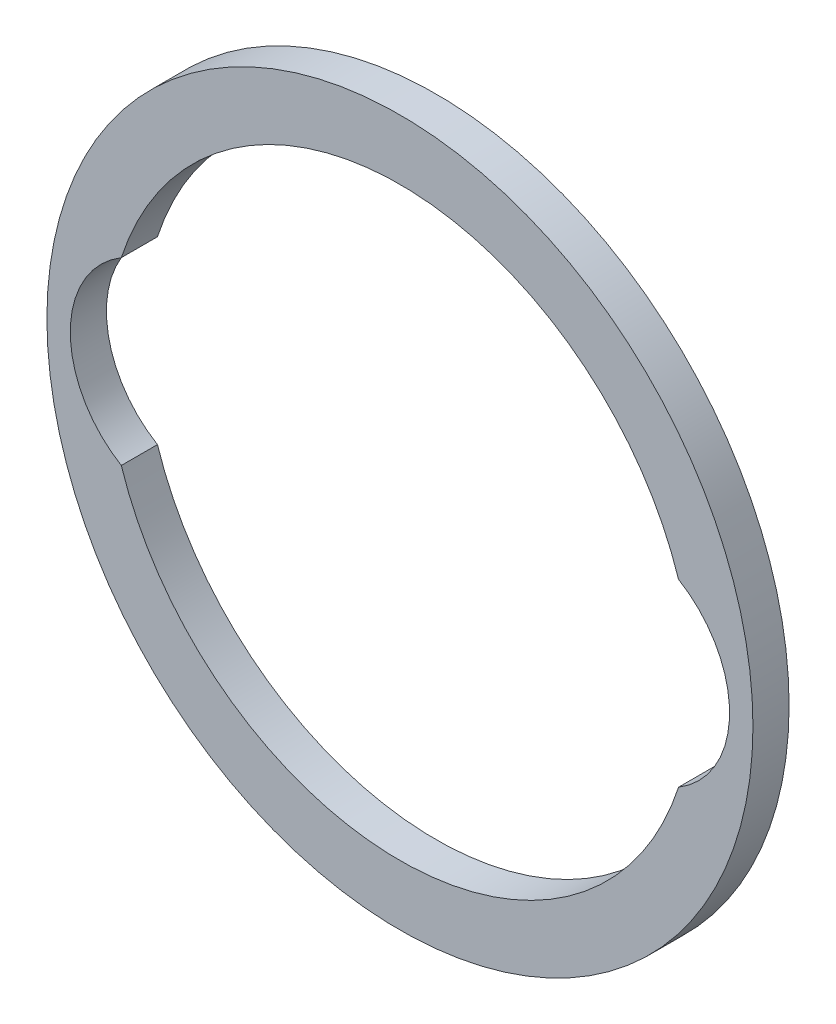
ISO-10303-21;
HEADER;
FILE_DESCRIPTION(('STEP AP214'),'2;1');
FILE_NAME('part.step','',(''),(''),'','','');
FILE_SCHEMA(('AUTOMOTIVE_DESIGN { 1 0 10303 214 1 1 1 1 }'));
ENDSEC;
DATA;
#1=APPLICATION_CONTEXT('core data for automotive mechanical design processes');
#2=APPLICATION_PROTOCOL_DEFINITION('international standard','automotive_design',2000,#1);
#3=PRODUCT_CONTEXT('',#1,'mechanical');
#4=PRODUCT('Part','Part','',(#3));
#5=PRODUCT_RELATED_PRODUCT_CATEGORY('part','',(#4));
#6=PRODUCT_DEFINITION_FORMATION('','',#4);
#7=PRODUCT_DEFINITION_CONTEXT('part definition',#1,'design');
#8=PRODUCT_DEFINITION('design','',#6,#7);
#9=PRODUCT_DEFINITION_SHAPE('','',#8);
#10=(LENGTH_UNIT() NAMED_UNIT(*) SI_UNIT(.MILLI.,.METRE.));
#11=(NAMED_UNIT(*) PLANE_ANGLE_UNIT() SI_UNIT($,.RADIAN.));
#12=(NAMED_UNIT(*) SI_UNIT($,.STERADIAN.) SOLID_ANGLE_UNIT());
#13=UNCERTAINTY_MEASURE_WITH_UNIT(LENGTH_MEASURE(1.E-05),#10,'distance_accuracy_value','');
#14=(GEOMETRIC_REPRESENTATION_CONTEXT(3) GLOBAL_UNCERTAINTY_ASSIGNED_CONTEXT((#13)) GLOBAL_UNIT_ASSIGNED_CONTEXT((#10,
#11,#12)) REPRESENTATION_CONTEXT('',''));
#15=CARTESIAN_POINT('',(0.,0.,0.));
#16=DIRECTION('',(0.,0.,1.));
#17=DIRECTION('',(1.,0.,0.));
#18=AXIS2_PLACEMENT_3D('',#15,#16,#17);
#19=CARTESIAN_POINT('',(-37.3215231594437,0.00123870368374164,6.));
#20=DIRECTION('',(0.,0.,-1.));
#21=DIRECTION('',(-1.,0.,0.));
#22=AXIS2_PLACEMENT_3D('',#19,#20,#21);
#23=CYLINDRICAL_SURFACE('',#22,17.4);
#24=CARTESIAN_POINT('',(-37.3215231594437,0.00123870368374164,0.));
#25=DIRECTION('',(0.,0.,1.));
#26=DIRECTION('',(1.,0.,0.));
#27=AXIS2_PLACEMENT_3D('',#24,#25,#26);
#28=CIRCLE('',#27,17.4);
#29=CARTESIAN_POINT('',(-46.2485557715222,-14.9342254251235,0.));
#30=VERTEX_POINT('',#29);
#31=CARTESIAN_POINT('',(-46.2475643338818,14.9372953771245,0.));
#32=VERTEX_POINT('',#31);
#33=EDGE_CURVE('E103',#30,#32,#28,.F.);
#34=ORIENTED_EDGE('',*,*,#33,.T.);
#35=DIRECTION('',(0.,0.,-1.));
#36=VECTOR('',#35,1.);
#37=CARTESIAN_POINT('',(-46.2475643338818,14.9372953771245,6.));
#38=LINE('',#37,#36);
#39=CARTESIAN_POINT('',(-46.2475643338818,14.9372953771245,6.));
#40=VERTEX_POINT('',#39);
#41=EDGE_CURVE('E11',#40,#32,#38,.T.);
#42=ORIENTED_EDGE('',*,*,#41,.F.);
#43=CARTESIAN_POINT('',(-37.3215231594437,0.00123870368374164,6.));
#44=DIRECTION('',(0.,0.,1.));
#45=DIRECTION('',(1.,0.,0.));
#46=AXIS2_PLACEMENT_3D('',#43,#44,#45);
#47=CIRCLE('',#46,17.4);
#48=CARTESIAN_POINT('',(-46.2485557715222,-14.9342254251235,6.));
#49=VERTEX_POINT('',#48);
#50=EDGE_CURVE('E76',#49,#40,#47,.F.);
#51=ORIENTED_EDGE('',*,*,#50,.F.);
#52=DIRECTION('',(0.,0.,-1.));
#53=VECTOR('',#52,1.);
#54=CARTESIAN_POINT('',(-46.2485557715222,-14.9342254251235,6.));
#55=LINE('',#54,#53);
#56=EDGE_CURVE('E52',#49,#30,#55,.T.);
#57=ORIENTED_EDGE('',*,*,#56,.T.);
#58=EDGE_LOOP('',(#34,#42,#51,#57));
#59=FACE_BOUND('',#58,.T.);
#60=ADVANCED_FACE('F36',(#59),#23,.F.);
#61=CARTESIAN_POINT('',(0.,0.,6.));
#62=DIRECTION('',(0.,0.,-1.));
#63=DIRECTION('',(-1.,0.,0.));
#64=AXIS2_PLACEMENT_3D('',#61,#62,#63);
#65=CYLINDRICAL_SURFACE('',#64,48.6);
#66=CARTESIAN_POINT('',(0.,0.,0.));
#67=DIRECTION('',(0.,0.,1.));
#68=DIRECTION('',(1.,0.,0.));
#69=AXIS2_PLACEMENT_3D('',#66,#67,#68);
#70=CIRCLE('',#69,48.6);
#71=CARTESIAN_POINT('',(46.2475643338818,14.9372953771245,0.));
#72=VERTEX_POINT('',#71);
#73=EDGE_CURVE('E85',#72,#32,#70,.T.);
#74=ORIENTED_EDGE('',*,*,#73,.F.);
#75=DIRECTION('',(0.,0.,-1.));
#76=VECTOR('',#75,1.);
#77=CARTESIAN_POINT('',(46.2475643338818,14.9372953771245,6.));
#78=LINE('',#77,#76);
#79=CARTESIAN_POINT('',(46.2475643338818,14.9372953771245,6.));
#80=VERTEX_POINT('',#79);
#81=EDGE_CURVE('E44',#80,#72,#78,.T.);
#82=ORIENTED_EDGE('',*,*,#81,.F.);
#83=CARTESIAN_POINT('',(0.,0.,6.));
#84=DIRECTION('',(0.,0.,1.));
#85=DIRECTION('',(1.,0.,0.));
#86=AXIS2_PLACEMENT_3D('',#83,#84,#85);
#87=CIRCLE('',#86,48.6);
#88=EDGE_CURVE('E83',#80,#40,#87,.T.);
#89=ORIENTED_EDGE('',*,*,#88,.T.);
#90=ORIENTED_EDGE('',*,*,#41,.T.);
#91=EDGE_LOOP('',(#74,#82,#89,#90));
#92=FACE_BOUND('',#91,.T.);
#93=ADVANCED_FACE('F82',(#92),#65,.F.);
#94=CARTESIAN_POINT('',(37.3215231594437,0.00123870368375079,6.));
#95=DIRECTION('',(0.,0.,-1.));
#96=DIRECTION('',(-1.,0.,0.));
#97=AXIS2_PLACEMENT_3D('',#94,#95,#96);
#98=CYLINDRICAL_SURFACE('',#97,17.4);
#99=CARTESIAN_POINT('',(37.3215231594437,0.00123870368375079,0.));
#100=DIRECTION('',(0.,0.,1.));
#101=DIRECTION('',(1.,0.,0.));
#102=AXIS2_PLACEMENT_3D('',#99,#100,#101);
#103=CIRCLE('',#102,17.4);
#104=CARTESIAN_POINT('',(46.2485557715222,-14.9342254251235,0.));
#105=VERTEX_POINT('',#104);
#106=EDGE_CURVE('E106',#105,#72,#103,.T.);
#107=ORIENTED_EDGE('',*,*,#106,.F.);
#108=DIRECTION('',(0.,0.,-1.));
#109=VECTOR('',#108,1.);
#110=CARTESIAN_POINT('',(46.2485557715222,-14.9342254251235,6.));
#111=LINE('',#110,#109);
#112=CARTESIAN_POINT('',(46.2485557715222,-14.9342254251235,6.));
#113=VERTEX_POINT('',#112);
#114=EDGE_CURVE('E65',#113,#105,#111,.T.);
#115=ORIENTED_EDGE('',*,*,#114,.F.);
#116=CARTESIAN_POINT('',(37.3215231594437,0.00123870368375079,6.));
#117=DIRECTION('',(0.,0.,1.));
#118=DIRECTION('',(1.,0.,0.));
#119=AXIS2_PLACEMENT_3D('',#116,#117,#118);
#120=CIRCLE('',#119,17.4);
#121=EDGE_CURVE('E92',#113,#80,#120,.T.);
#122=ORIENTED_EDGE('',*,*,#121,.T.);
#123=ORIENTED_EDGE('',*,*,#81,.T.);
#124=EDGE_LOOP('',(#107,#115,#122,#123));
#125=FACE_BOUND('',#124,.T.);
#126=ADVANCED_FACE('F94',(#125),#98,.F.);
#127=CARTESIAN_POINT('',(0.,0.,6.));
#128=DIRECTION('',(0.,0.,-1.));
#129=DIRECTION('',(-1.,0.,0.));
#130=AXIS2_PLACEMENT_3D('',#127,#128,#129);
#131=CYLINDRICAL_SURFACE('',#130,48.6);
#132=CARTESIAN_POINT('',(0.,0.,0.));
#133=DIRECTION('',(0.,0.,1.));
#134=DIRECTION('',(1.,0.,0.));
#135=AXIS2_PLACEMENT_3D('',#132,#133,#134);
#136=CIRCLE('',#135,48.6);
#137=EDGE_CURVE('E108',#30,#105,#136,.T.);
#138=ORIENTED_EDGE('',*,*,#137,.F.);
#139=ORIENTED_EDGE('',*,*,#56,.F.);
#140=CARTESIAN_POINT('',(0.,0.,6.));
#141=DIRECTION('',(0.,0.,1.));
#142=DIRECTION('',(1.,0.,0.));
#143=AXIS2_PLACEMENT_3D('',#140,#141,#142);
#144=CIRCLE('',#143,48.6);
#145=EDGE_CURVE('E95',#49,#113,#144,.T.);
#146=ORIENTED_EDGE('',*,*,#145,.T.);
#147=ORIENTED_EDGE('',*,*,#114,.T.);
#148=EDGE_LOOP('',(#138,#139,#146,#147));
#149=FACE_BOUND('',#148,.T.);
#150=ADVANCED_FACE('F121',(#149),#131,.F.);
#151=CARTESIAN_POINT('',(0.,0.,6.));
#152=DIRECTION('',(0.,0.,-1.));
#153=DIRECTION('',(-1.,0.,0.));
#154=AXIS2_PLACEMENT_3D('',#151,#152,#153);
#155=CYLINDRICAL_SURFACE('',#154,58.6);
#156=CARTESIAN_POINT('',(0.,0.,6.));
#157=DIRECTION('',(0.,0.,1.));
#158=DIRECTION('',(1.,0.,0.));
#159=AXIS2_PLACEMENT_3D('',#156,#157,#158);
#160=CIRCLE('',#159,58.6);
#161=CARTESIAN_POINT('',(58.6,0.,6.));
#162=VERTEX_POINT('',#161);
#163=EDGE_CURVE('E97',#162,#162,#160,.F.);
#164=ORIENTED_EDGE('',*,*,#163,.T.);
#165=EDGE_LOOP('',(#164));
#166=FACE_BOUND('',#165,.T.);
#167=CARTESIAN_POINT('',(0.,0.,0.));
#168=DIRECTION('',(0.,0.,1.));
#169=DIRECTION('',(1.,0.,0.));
#170=AXIS2_PLACEMENT_3D('',#167,#168,#169);
#171=CIRCLE('',#170,58.6);
#172=CARTESIAN_POINT('',(58.6,0.,0.));
#173=VERTEX_POINT('',#172);
#174=EDGE_CURVE('E111',#173,#173,#171,.F.);
#175=ORIENTED_EDGE('',*,*,#174,.F.);
#176=EDGE_LOOP('',(#175));
#177=FACE_BOUND('',#176,.T.);
#178=ADVANCED_FACE('F119',(#166,#177),#155,.T.);
#179=CARTESIAN_POINT('',(0.,0.,6.));
#180=DIRECTION('',(0.,0.,1.));
#181=DIRECTION('',(1.,0.,0.));
#182=AXIS2_PLACEMENT_3D('',#179,#180,#181);
#183=PLANE('',#182);
#184=ORIENTED_EDGE('',*,*,#50,.T.);
#185=ORIENTED_EDGE('',*,*,#88,.F.);
#186=ORIENTED_EDGE('',*,*,#121,.F.);
#187=ORIENTED_EDGE('',*,*,#145,.F.);
#188=EDGE_LOOP('',(#184,#185,#186,#187));
#189=FACE_BOUND('',#188,.T.);
#190=ORIENTED_EDGE('',*,*,#163,.F.);
#191=EDGE_LOOP('',(#190));
#192=FACE_BOUND('',#191,.T.);
#193=ADVANCED_FACE('F90',(#189,#192),#183,.T.);
#194=CARTESIAN_POINT('',(0.,0.,0.));
#195=DIRECTION('',(0.,0.,1.));
#196=DIRECTION('',(1.,0.,0.));
#197=AXIS2_PLACEMENT_3D('',#194,#195,#196);
#198=PLANE('',#197);
#199=ORIENTED_EDGE('',*,*,#33,.F.);
#200=ORIENTED_EDGE('',*,*,#137,.T.);
#201=ORIENTED_EDGE('',*,*,#106,.T.);
#202=ORIENTED_EDGE('',*,*,#73,.T.);
#203=EDGE_LOOP('',(#199,#200,#201,#202));
#204=FACE_BOUND('',#203,.T.);
#205=ORIENTED_EDGE('',*,*,#174,.T.);
#206=EDGE_LOOP('',(#205));
#207=FACE_BOUND('',#206,.T.);
#208=ADVANCED_FACE('F117',(#204,#207),#198,.F.);
#209=CLOSED_SHELL('',(#60,#93,#126,#150,#178,#193,#208));
#210=MANIFOLD_SOLID_BREP('B2',#209);
#211=ADVANCED_BREP_SHAPE_REPRESENTATION('',(#18,#210),#14);
#212=SHAPE_DEFINITION_REPRESENTATION(#9,#211);
ENDSEC;
END-ISO-10303-21;
